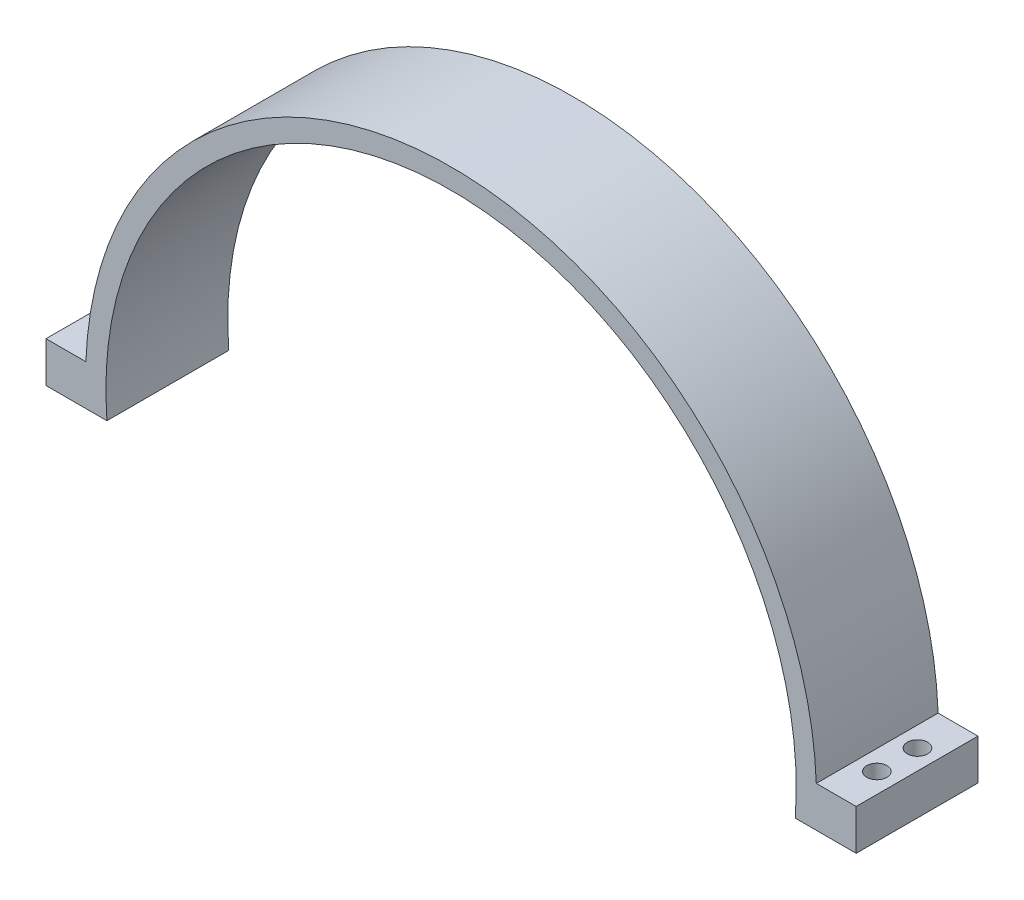
ISO-10303-21;
HEADER;
FILE_DESCRIPTION(('STEP AP214'),'2;1');
FILE_NAME('part.step','',(''),(''),'','','');
FILE_SCHEMA(('AUTOMOTIVE_DESIGN { 1 0 10303 214 1 1 1 1 }'));
ENDSEC;
DATA;
#1=APPLICATION_CONTEXT('core data for automotive mechanical design processes');
#2=APPLICATION_PROTOCOL_DEFINITION('international standard','automotive_design',2000,#1);
#3=PRODUCT_CONTEXT('',#1,'mechanical');
#4=PRODUCT('Part','Part','',(#3));
#5=PRODUCT_RELATED_PRODUCT_CATEGORY('part','',(#4));
#6=PRODUCT_DEFINITION_FORMATION('','',#4);
#7=PRODUCT_DEFINITION_CONTEXT('part definition',#1,'design');
#8=PRODUCT_DEFINITION('design','',#6,#7);
#9=PRODUCT_DEFINITION_SHAPE('','',#8);
#10=(LENGTH_UNIT() NAMED_UNIT(*) SI_UNIT(.MILLI.,.METRE.));
#11=(NAMED_UNIT(*) PLANE_ANGLE_UNIT() SI_UNIT($,.RADIAN.));
#12=(NAMED_UNIT(*) SI_UNIT($,.STERADIAN.) SOLID_ANGLE_UNIT());
#13=UNCERTAINTY_MEASURE_WITH_UNIT(LENGTH_MEASURE(1.E-05),#10,'distance_accuracy_value','');
#14=(GEOMETRIC_REPRESENTATION_CONTEXT(3) GLOBAL_UNCERTAINTY_ASSIGNED_CONTEXT((#13)) GLOBAL_UNIT_ASSIGNED_CONTEXT((#10,
#11,#12)) REPRESENTATION_CONTEXT('',''));
#15=CARTESIAN_POINT('',(0.,0.,0.));
#16=DIRECTION('',(0.,0.,1.));
#17=DIRECTION('',(1.,0.,0.));
#18=AXIS2_PLACEMENT_3D('',#15,#16,#17);
#19=CARTESIAN_POINT('',(0.,0.,30.));
#20=DIRECTION('',(0.,0.,-1.));
#21=DIRECTION('',(-1.,0.,0.));
#22=AXIS2_PLACEMENT_3D('',#19,#20,#21);
#23=CYLINDRICAL_SURFACE('',#22,90.);
#24=CARTESIAN_POINT('',(0.,0.,0.));
#25=DIRECTION('',(0.,0.,1.));
#26=DIRECTION('',(1.,0.,0.));
#27=AXIS2_PLACEMENT_3D('',#24,#25,#26);
#28=CIRCLE('',#27,90.);
#29=CARTESIAN_POINT('',(89.9329012415473,3.47466175017019,0.));
#30=VERTEX_POINT('',#29);
#31=CARTESIAN_POINT('',(-89.9329012415473,3.47466175017025,0.));
#32=VERTEX_POINT('',#31);
#33=EDGE_CURVE('E131',#30,#32,#28,.T.);
#34=ORIENTED_EDGE('',*,*,#33,.T.);
#35=DIRECTION('',(0.,0.,-1.));
#36=VECTOR('',#35,1.);
#37=CARTESIAN_POINT('',(-89.9329012415473,3.47466175017025,30.));
#38=LINE('',#37,#36);
#39=CARTESIAN_POINT('',(-89.9329012415473,3.47466175017025,30.));
#40=VERTEX_POINT('',#39);
#41=EDGE_CURVE('E11',#40,#32,#38,.T.);
#42=ORIENTED_EDGE('',*,*,#41,.F.);
#43=CARTESIAN_POINT('',(0.,0.,30.));
#44=DIRECTION('',(0.,0.,1.));
#45=DIRECTION('',(1.,0.,0.));
#46=AXIS2_PLACEMENT_3D('',#43,#44,#45);
#47=CIRCLE('',#46,90.);
#48=CARTESIAN_POINT('',(89.9329012415473,3.47466175017019,30.));
#49=VERTEX_POINT('',#48);
#50=EDGE_CURVE('E145',#49,#40,#47,.T.);
#51=ORIENTED_EDGE('',*,*,#50,.F.);
#52=DIRECTION('',(0.,0.,-1.));
#53=VECTOR('',#52,1.);
#54=CARTESIAN_POINT('',(89.9329012415473,3.47466175017019,30.));
#55=LINE('',#54,#53);
#56=EDGE_CURVE('E127',#49,#30,#55,.T.);
#57=ORIENTED_EDGE('',*,*,#56,.T.);
#58=EDGE_LOOP('',(#34,#42,#51,#57));
#59=FACE_BOUND('',#58,.T.);
#60=ADVANCED_FACE('F33',(#59),#23,.T.);
#61=CARTESIAN_POINT('',(-89.9329012415473,3.47466175017025,30.));
#62=DIRECTION('',(0.,-1.,0.));
#63=DIRECTION('',(1.,0.,0.));
#64=AXIS2_PLACEMENT_3D('',#61,#62,#63);
#65=PLANE('',#64);
#66=CARTESIAN_POINT('',(-94.8410301488507,3.47466175016953,20.));
#67=DIRECTION('',(0.,1.,0.));
#68=DIRECTION('',(-1.,0.,0.));
#69=AXIS2_PLACEMENT_3D('',#66,#67,#68);
#70=CIRCLE('',#69,2.50000000000001);
#71=CARTESIAN_POINT('',(-97.3410301488507,3.47466175016953,20.));
#72=VERTEX_POINT('',#71);
#73=EDGE_CURVE('E258',#72,#72,#70,.T.);
#74=ORIENTED_EDGE('',*,*,#73,.F.);
#75=EDGE_LOOP('',(#74));
#76=FACE_BOUND('',#75,.T.);
#77=CARTESIAN_POINT('',(-94.8410301488507,3.47466175016953,10.));
#78=DIRECTION('',(0.,1.,0.));
#79=DIRECTION('',(-1.,0.,0.));
#80=AXIS2_PLACEMENT_3D('',#77,#78,#79);
#81=CIRCLE('',#80,2.49999999999999);
#82=CARTESIAN_POINT('',(-97.3410301488507,3.47466175016953,10.));
#83=VERTEX_POINT('',#82);
#84=EDGE_CURVE('E168',#83,#83,#81,.T.);
#85=ORIENTED_EDGE('',*,*,#84,.F.);
#86=EDGE_LOOP('',(#85));
#87=FACE_BOUND('',#86,.T.);
#88=DIRECTION('',(-1.,0.,0.));
#89=VECTOR('',#88,1.);
#90=CARTESIAN_POINT('',(-89.9329012415473,3.47466175017025,0.));
#91=LINE('',#90,#89);
#92=CARTESIAN_POINT('',(-99.7491590561541,3.47466175017024,0.));
#93=VERTEX_POINT('',#92);
#94=EDGE_CURVE('E134',#32,#93,#91,.T.);
#95=ORIENTED_EDGE('',*,*,#94,.T.);
#96=DIRECTION('',(0.,0.,-1.));
#97=VECTOR('',#96,1.);
#98=CARTESIAN_POINT('',(-99.7491590561541,3.47466175017024,30.));
#99=LINE('',#98,#97);
#100=CARTESIAN_POINT('',(-99.7491590561541,3.47466175017024,30.));
#101=VERTEX_POINT('',#100);
#102=EDGE_CURVE('E42',#101,#93,#99,.T.);
#103=ORIENTED_EDGE('',*,*,#102,.F.);
#104=DIRECTION('',(-1.,0.,0.));
#105=VECTOR('',#104,1.);
#106=CARTESIAN_POINT('',(-89.9329012415473,3.47466175017025,30.));
#107=LINE('',#106,#105);
#108=EDGE_CURVE('E94',#40,#101,#107,.T.);
#109=ORIENTED_EDGE('',*,*,#108,.F.);
#110=ORIENTED_EDGE('',*,*,#41,.T.);
#111=EDGE_LOOP('',(#95,#103,#109,#110));
#112=FACE_BOUND('',#111,.T.);
#113=ADVANCED_FACE('F208',(#76,#87,#112),#65,.F.);
#114=CARTESIAN_POINT('',(-99.7491590561541,3.47466175017024,30.));
#115=DIRECTION('',(1.,0.,0.));
#116=DIRECTION('',(0.,0.,-1.));
#117=AXIS2_PLACEMENT_3D('',#114,#115,#116);
#118=PLANE('',#117);
#119=DIRECTION('',(0.,-1.,0.));
#120=VECTOR('',#119,1.);
#121=CARTESIAN_POINT('',(-99.7491590561541,3.47466175017024,0.));
#122=LINE('',#121,#120);
#123=CARTESIAN_POINT('',(-99.7491590561541,-6.52533824982976,0.));
#124=VERTEX_POINT('',#123);
#125=EDGE_CURVE('E136',#93,#124,#122,.T.);
#126=ORIENTED_EDGE('',*,*,#125,.T.);
#127=DIRECTION('',(0.,0.,-1.));
#128=VECTOR('',#127,1.);
#129=CARTESIAN_POINT('',(-99.7491590561541,-6.52533824982976,30.));
#130=LINE('',#129,#128);
#131=CARTESIAN_POINT('',(-99.7491590561541,-6.52533824982976,30.));
#132=VERTEX_POINT('',#131);
#133=EDGE_CURVE('E152',#132,#124,#130,.T.);
#134=ORIENTED_EDGE('',*,*,#133,.F.);
#135=DIRECTION('',(0.,-1.,0.));
#136=VECTOR('',#135,1.);
#137=CARTESIAN_POINT('',(-99.7491590561541,3.47466175017024,30.));
#138=LINE('',#137,#136);
#139=EDGE_CURVE('E174',#101,#132,#138,.T.);
#140=ORIENTED_EDGE('',*,*,#139,.F.);
#141=ORIENTED_EDGE('',*,*,#102,.T.);
#142=EDGE_LOOP('',(#126,#134,#140,#141));
#143=FACE_BOUND('',#142,.T.);
#144=ADVANCED_FACE('F212',(#143),#118,.F.);
#145=CARTESIAN_POINT('',(-99.7491590561541,-6.52533824982976,30.));
#146=DIRECTION('',(0.,1.,0.));
#147=DIRECTION('',(-1.,0.,0.));
#148=AXIS2_PLACEMENT_3D('',#145,#146,#147);
#149=PLANE('',#148);
#150=CARTESIAN_POINT('',(-94.8410301488507,-6.52533824982976,20.));
#151=DIRECTION('',(0.,1.,0.));
#152=DIRECTION('',(-1.,0.,0.));
#153=AXIS2_PLACEMENT_3D('',#150,#151,#152);
#154=CIRCLE('',#153,2.50000000000001);
#155=CARTESIAN_POINT('',(-97.3410301488507,-6.52533824982976,20.));
#156=VERTEX_POINT('',#155);
#157=EDGE_CURVE('E36',#156,#156,#154,.T.);
#158=ORIENTED_EDGE('',*,*,#157,.T.);
#159=EDGE_LOOP('',(#158));
#160=FACE_BOUND('',#159,.T.);
#161=CARTESIAN_POINT('',(-94.8410301488507,-6.52533824982976,10.));
#162=DIRECTION('',(0.,1.,0.));
#163=DIRECTION('',(-1.,0.,0.));
#164=AXIS2_PLACEMENT_3D('',#161,#162,#163);
#165=CIRCLE('',#164,2.49999999999999);
#166=CARTESIAN_POINT('',(-97.3410301488507,-6.52533824982976,10.));
#167=VERTEX_POINT('',#166);
#168=EDGE_CURVE('E156',#167,#167,#165,.T.);
#169=ORIENTED_EDGE('',*,*,#168,.T.);
#170=EDGE_LOOP('',(#169));
#171=FACE_BOUND('',#170,.T.);
#172=DIRECTION('',(1.,0.,0.));
#173=VECTOR('',#172,1.);
#174=CARTESIAN_POINT('',(-99.7491590561541,-6.52533824982976,0.));
#175=LINE('',#174,#173);
#176=CARTESIAN_POINT('',(-84.7491590561541,-6.52533824982976,0.));
#177=VERTEX_POINT('',#176);
#178=EDGE_CURVE('E138',#124,#177,#175,.T.);
#179=ORIENTED_EDGE('',*,*,#178,.T.);
#180=DIRECTION('',(0.,0.,-1.));
#181=VECTOR('',#180,1.);
#182=CARTESIAN_POINT('',(-84.7491590561541,-6.52533824982976,30.));
#183=LINE('',#182,#181);
#184=CARTESIAN_POINT('',(-84.7491590561541,-6.52533824982976,30.));
#185=VERTEX_POINT('',#184);
#186=EDGE_CURVE('E149',#185,#177,#183,.T.);
#187=ORIENTED_EDGE('',*,*,#186,.F.);
#188=DIRECTION('',(1.,0.,0.));
#189=VECTOR('',#188,1.);
#190=CARTESIAN_POINT('',(-99.7491590561541,-6.52533824982976,30.));
#191=LINE('',#190,#189);
#192=EDGE_CURVE('E176',#132,#185,#191,.T.);
#193=ORIENTED_EDGE('',*,*,#192,.F.);
#194=ORIENTED_EDGE('',*,*,#133,.T.);
#195=EDGE_LOOP('',(#179,#187,#193,#194));
#196=FACE_BOUND('',#195,.T.);
#197=ADVANCED_FACE('F182',(#160,#171,#196),#149,.F.);
#198=CARTESIAN_POINT('',(0.,0.,30.));
#199=DIRECTION('',(0.,0.,-1.));
#200=DIRECTION('',(-1.,0.,0.));
#201=AXIS2_PLACEMENT_3D('',#198,#199,#200);
#202=CYLINDRICAL_SURFACE('',#201,85.);
#203=CARTESIAN_POINT('',(0.,0.,0.));
#204=DIRECTION('',(0.,0.,-1.));
#205=DIRECTION('',(1.,0.,0.));
#206=AXIS2_PLACEMENT_3D('',#203,#204,#205);
#207=CIRCLE('',#206,85.);
#208=CARTESIAN_POINT('',(84.7491590561541,-6.52533824982982,0.));
#209=VERTEX_POINT('',#208);
#210=EDGE_CURVE('E140',#177,#209,#207,.T.);
#211=ORIENTED_EDGE('',*,*,#210,.T.);
#212=DIRECTION('',(0.,0.,-1.));
#213=VECTOR('',#212,1.);
#214=CARTESIAN_POINT('',(84.7491590561541,-6.52533824982982,30.));
#215=LINE('',#214,#213);
#216=CARTESIAN_POINT('',(84.7491590561541,-6.52533824982982,30.));
#217=VERTEX_POINT('',#216);
#218=EDGE_CURVE('E122',#217,#209,#215,.T.);
#219=ORIENTED_EDGE('',*,*,#218,.F.);
#220=CARTESIAN_POINT('',(0.,0.,30.));
#221=DIRECTION('',(0.,0.,-1.));
#222=DIRECTION('',(1.,0.,0.));
#223=AXIS2_PLACEMENT_3D('',#220,#221,#222);
#224=CIRCLE('',#223,85.);
#225=EDGE_CURVE('E113',#185,#217,#224,.T.);
#226=ORIENTED_EDGE('',*,*,#225,.F.);
#227=ORIENTED_EDGE('',*,*,#186,.T.);
#228=EDGE_LOOP('',(#211,#219,#226,#227));
#229=FACE_BOUND('',#228,.T.);
#230=ADVANCED_FACE('F186',(#229),#202,.F.);
#231=CARTESIAN_POINT('',(99.7491590561542,-6.52533824982974,30.));
#232=DIRECTION('',(0.,1.,0.));
#233=DIRECTION('',(-1.,0.,0.));
#234=AXIS2_PLACEMENT_3D('',#231,#232,#233);
#235=PLANE('',#234);
#236=CARTESIAN_POINT('',(94.8410301488507,-6.52533824982976,9.99999999999998));
#237=DIRECTION('',(0.,1.,0.));
#238=DIRECTION('',(-1.,0.,0.));
#239=AXIS2_PLACEMENT_3D('',#236,#237,#238);
#240=CIRCLE('',#239,2.49999999999999);
#241=CARTESIAN_POINT('',(92.3410301488507,-6.52533824982978,9.99999999999998));
#242=VERTEX_POINT('',#241);
#243=EDGE_CURVE('E158',#242,#242,#240,.T.);
#244=ORIENTED_EDGE('',*,*,#243,.T.);
#245=EDGE_LOOP('',(#244));
#246=FACE_BOUND('',#245,.T.);
#247=CARTESIAN_POINT('',(94.8410301488507,-6.52533824982976,20.));
#248=DIRECTION('',(0.,1.,0.));
#249=DIRECTION('',(-1.,0.,0.));
#250=AXIS2_PLACEMENT_3D('',#247,#248,#249);
#251=CIRCLE('',#250,2.50000000000001);
#252=CARTESIAN_POINT('',(92.3410301488506,-6.52533824982978,20.));
#253=VERTEX_POINT('',#252);
#254=EDGE_CURVE('E163',#253,#253,#251,.T.);
#255=ORIENTED_EDGE('',*,*,#254,.T.);
#256=EDGE_LOOP('',(#255));
#257=FACE_BOUND('',#256,.T.);
#258=DIRECTION('',(1.,0.,0.));
#259=VECTOR('',#258,1.);
#260=CARTESIAN_POINT('',(99.7491590561542,-6.52533824982974,0.));
#261=LINE('',#260,#259);
#262=CARTESIAN_POINT('',(99.7491590561542,-6.52533824982974,0.));
#263=VERTEX_POINT('',#262);
#264=EDGE_CURVE('E121',#209,#263,#261,.T.);
#265=ORIENTED_EDGE('',*,*,#264,.T.);
#266=DIRECTION('',(0.,0.,-1.));
#267=VECTOR('',#266,1.);
#268=CARTESIAN_POINT('',(99.7491590561542,-6.52533824982974,30.));
#269=LINE('',#268,#267);
#270=CARTESIAN_POINT('',(99.7491590561542,-6.52533824982974,30.));
#271=VERTEX_POINT('',#270);
#272=EDGE_CURVE('E118',#271,#263,#269,.T.);
#273=ORIENTED_EDGE('',*,*,#272,.F.);
#274=DIRECTION('',(1.,0.,0.));
#275=VECTOR('',#274,1.);
#276=CARTESIAN_POINT('',(99.7491590561542,-6.52533824982974,30.));
#277=LINE('',#276,#275);
#278=EDGE_CURVE('E107',#217,#271,#277,.T.);
#279=ORIENTED_EDGE('',*,*,#278,.F.);
#280=ORIENTED_EDGE('',*,*,#218,.T.);
#281=EDGE_LOOP('',(#265,#273,#279,#280));
#282=FACE_BOUND('',#281,.T.);
#283=ADVANCED_FACE('F119',(#246,#257,#282),#235,.F.);
#284=CARTESIAN_POINT('',(99.7491590561542,3.47466175017026,30.));
#285=DIRECTION('',(-1.,0.,0.));
#286=DIRECTION('',(0.,0.,1.));
#287=AXIS2_PLACEMENT_3D('',#284,#285,#286);
#288=PLANE('',#287);
#289=DIRECTION('',(0.,1.,0.));
#290=VECTOR('',#289,1.);
#291=CARTESIAN_POINT('',(99.7491590561542,3.47466175017026,0.));
#292=LINE('',#291,#290);
#293=CARTESIAN_POINT('',(99.7491590561542,3.47466175017026,0.));
#294=VERTEX_POINT('',#293);
#295=EDGE_CURVE('E80',#263,#294,#292,.T.);
#296=ORIENTED_EDGE('',*,*,#295,.T.);
#297=DIRECTION('',(0.,0.,-1.));
#298=VECTOR('',#297,1.);
#299=CARTESIAN_POINT('',(99.7491590561542,3.47466175017026,30.));
#300=LINE('',#299,#298);
#301=CARTESIAN_POINT('',(99.7491590561542,3.47466175017026,30.));
#302=VERTEX_POINT('',#301);
#303=EDGE_CURVE('E123',#302,#294,#300,.T.);
#304=ORIENTED_EDGE('',*,*,#303,.F.);
#305=DIRECTION('',(0.,1.,0.));
#306=VECTOR('',#305,1.);
#307=CARTESIAN_POINT('',(99.7491590561542,3.47466175017026,30.));
#308=LINE('',#307,#306);
#309=EDGE_CURVE('E111',#271,#302,#308,.T.);
#310=ORIENTED_EDGE('',*,*,#309,.F.);
#311=ORIENTED_EDGE('',*,*,#272,.T.);
#312=EDGE_LOOP('',(#296,#304,#310,#311));
#313=FACE_BOUND('',#312,.T.);
#314=ADVANCED_FACE('F125',(#313),#288,.F.);
#315=CARTESIAN_POINT('',(89.9329012415473,3.47466175017019,30.));
#316=DIRECTION('',(0.,-1.,0.));
#317=DIRECTION('',(1.,0.,0.));
#318=AXIS2_PLACEMENT_3D('',#315,#316,#317);
#319=PLANE('',#318);
#320=CARTESIAN_POINT('',(94.8410301488507,3.47466175016954,9.99999999999998));
#321=DIRECTION('',(0.,1.,0.));
#322=DIRECTION('',(1.,0.,0.));
#323=AXIS2_PLACEMENT_3D('',#320,#321,#322);
#324=CIRCLE('',#323,2.49999999999999);
#325=CARTESIAN_POINT('',(97.3410301488506,3.47466175016954,9.99999999999998));
#326=VERTEX_POINT('',#325);
#327=EDGE_CURVE('E263',#326,#326,#324,.T.);
#328=ORIENTED_EDGE('',*,*,#327,.F.);
#329=EDGE_LOOP('',(#328));
#330=FACE_BOUND('',#329,.T.);
#331=CARTESIAN_POINT('',(94.8410301488507,3.47466175016954,20.));
#332=DIRECTION('',(0.,1.,0.));
#333=DIRECTION('',(1.,0.,0.));
#334=AXIS2_PLACEMENT_3D('',#331,#332,#333);
#335=CIRCLE('',#334,2.50000000000001);
#336=CARTESIAN_POINT('',(97.3410301488507,3.47466175016954,20.));
#337=VERTEX_POINT('',#336);
#338=EDGE_CURVE('E260',#337,#337,#335,.T.);
#339=ORIENTED_EDGE('',*,*,#338,.F.);
#340=EDGE_LOOP('',(#339));
#341=FACE_BOUND('',#340,.T.);
#342=DIRECTION('',(-1.,0.,0.));
#343=VECTOR('',#342,1.);
#344=CARTESIAN_POINT('',(89.9329012415473,3.47466175017019,0.));
#345=LINE('',#344,#343);
#346=EDGE_CURVE('E86',#294,#30,#345,.T.);
#347=ORIENTED_EDGE('',*,*,#346,.T.);
#348=ORIENTED_EDGE('',*,*,#56,.F.);
#349=DIRECTION('',(-1.,0.,0.));
#350=VECTOR('',#349,1.);
#351=CARTESIAN_POINT('',(89.9329012415473,3.47466175017019,30.));
#352=LINE('',#351,#350);
#353=EDGE_CURVE('E51',#302,#49,#352,.T.);
#354=ORIENTED_EDGE('',*,*,#353,.F.);
#355=ORIENTED_EDGE('',*,*,#303,.T.);
#356=EDGE_LOOP('',(#347,#348,#354,#355));
#357=FACE_BOUND('',#356,.T.);
#358=ADVANCED_FACE('F194',(#330,#341,#357),#319,.F.);
#359=CARTESIAN_POINT('',(0.,0.,30.));
#360=DIRECTION('',(0.,0.,1.));
#361=DIRECTION('',(1.,0.,0.));
#362=AXIS2_PLACEMENT_3D('',#359,#360,#361);
#363=PLANE('',#362);
#364=ORIENTED_EDGE('',*,*,#50,.T.);
#365=ORIENTED_EDGE('',*,*,#108,.T.);
#366=ORIENTED_EDGE('',*,*,#139,.T.);
#367=ORIENTED_EDGE('',*,*,#192,.T.);
#368=ORIENTED_EDGE('',*,*,#225,.T.);
#369=ORIENTED_EDGE('',*,*,#278,.T.);
#370=ORIENTED_EDGE('',*,*,#309,.T.);
#371=ORIENTED_EDGE('',*,*,#353,.T.);
#372=EDGE_LOOP('',(#364,#365,#366,#367,#368,#369,#370,#371));
#373=FACE_BOUND('',#372,.T.);
#374=ADVANCED_FACE('F109',(#373),#363,.T.);
#375=CARTESIAN_POINT('',(0.,0.,0.));
#376=DIRECTION('',(0.,0.,1.));
#377=DIRECTION('',(1.,0.,0.));
#378=AXIS2_PLACEMENT_3D('',#375,#376,#377);
#379=PLANE('',#378);
#380=ORIENTED_EDGE('',*,*,#33,.F.);
#381=ORIENTED_EDGE('',*,*,#346,.F.);
#382=ORIENTED_EDGE('',*,*,#295,.F.);
#383=ORIENTED_EDGE('',*,*,#264,.F.);
#384=ORIENTED_EDGE('',*,*,#210,.F.);
#385=ORIENTED_EDGE('',*,*,#178,.F.);
#386=ORIENTED_EDGE('',*,*,#125,.F.);
#387=ORIENTED_EDGE('',*,*,#94,.F.);
#388=EDGE_LOOP('',(#380,#381,#382,#383,#384,#385,#386,#387));
#389=FACE_BOUND('',#388,.T.);
#390=ADVANCED_FACE('F189',(#389),#379,.F.);
#391=CARTESIAN_POINT('',(94.8410301488507,-26.5253382498305,20.));
#392=DIRECTION('',(0.,1.,0.));
#393=DIRECTION('',(-1.,0.,0.));
#394=AXIS2_PLACEMENT_3D('',#391,#392,#393);
#395=CYLINDRICAL_SURFACE('',#394,2.50000000000001);
#396=ORIENTED_EDGE('',*,*,#338,.T.);
#397=EDGE_LOOP('',(#396));
#398=FACE_BOUND('',#397,.T.);
#399=ORIENTED_EDGE('',*,*,#254,.F.);
#400=EDGE_LOOP('',(#399));
#401=FACE_BOUND('',#400,.T.);
#402=ADVANCED_FACE('F233',(#398,#401),#395,.F.);
#403=CARTESIAN_POINT('',(94.8410301488507,-26.5253382498305,9.99999999999998));
#404=DIRECTION('',(0.,1.,0.));
#405=DIRECTION('',(-1.,0.,0.));
#406=AXIS2_PLACEMENT_3D('',#403,#404,#405);
#407=CYLINDRICAL_SURFACE('',#406,2.49999999999999);
#408=ORIENTED_EDGE('',*,*,#327,.T.);
#409=EDGE_LOOP('',(#408));
#410=FACE_BOUND('',#409,.T.);
#411=ORIENTED_EDGE('',*,*,#243,.F.);
#412=EDGE_LOOP('',(#411));
#413=FACE_BOUND('',#412,.T.);
#414=ADVANCED_FACE('F235',(#410,#413),#407,.F.);
#415=CARTESIAN_POINT('',(-94.8410301488507,-26.5253382498305,10.));
#416=DIRECTION('',(0.,1.,0.));
#417=DIRECTION('',(-1.,0.,0.));
#418=AXIS2_PLACEMENT_3D('',#415,#416,#417);
#419=CYLINDRICAL_SURFACE('',#418,2.49999999999999);
#420=ORIENTED_EDGE('',*,*,#84,.T.);
#421=EDGE_LOOP('',(#420));
#422=FACE_BOUND('',#421,.T.);
#423=ORIENTED_EDGE('',*,*,#168,.F.);
#424=EDGE_LOOP('',(#423));
#425=FACE_BOUND('',#424,.T.);
#426=ADVANCED_FACE('F242',(#422,#425),#419,.F.);
#427=CARTESIAN_POINT('',(-94.8410301488507,-26.5253382498305,20.));
#428=DIRECTION('',(0.,1.,0.));
#429=DIRECTION('',(-1.,0.,0.));
#430=AXIS2_PLACEMENT_3D('',#427,#428,#429);
#431=CYLINDRICAL_SURFACE('',#430,2.50000000000001);
#432=ORIENTED_EDGE('',*,*,#73,.T.);
#433=EDGE_LOOP('',(#432));
#434=FACE_BOUND('',#433,.T.);
#435=ORIENTED_EDGE('',*,*,#157,.F.);
#436=EDGE_LOOP('',(#435));
#437=FACE_BOUND('',#436,.T.);
#438=ADVANCED_FACE('F247',(#434,#437),#431,.F.);
#439=CLOSED_SHELL('',(#60,#113,#144,#197,#230,#283,#314,#358,#374,#390,#402,#414,#426,#438));
#440=MANIFOLD_SOLID_BREP('B2',#439);
#441=ADVANCED_BREP_SHAPE_REPRESENTATION('',(#18,#440),#14);
#442=SHAPE_DEFINITION_REPRESENTATION(#9,#441);
ENDSEC;
END-ISO-10303-21;
